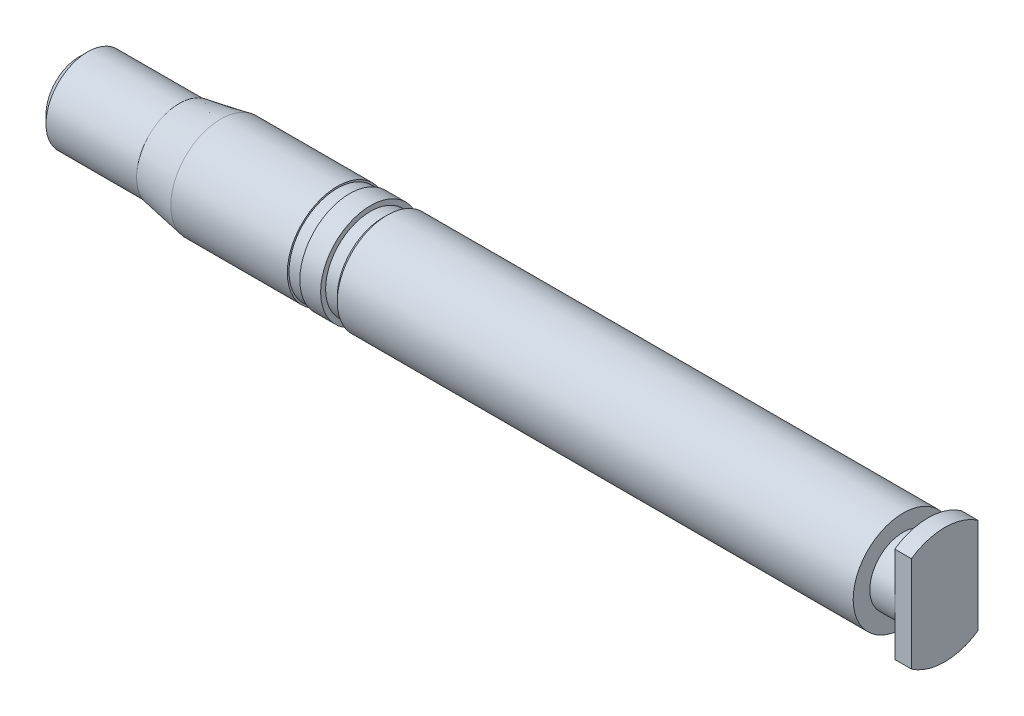
ISO-10303-21;
HEADER;
FILE_DESCRIPTION(('STEP AP214'),'2;1');
FILE_NAME('part.step','',(''),(''),'','','');
FILE_SCHEMA(('AUTOMOTIVE_DESIGN { 1 0 10303 214 1 1 1 1 }'));
ENDSEC;
DATA;
#1=APPLICATION_CONTEXT('core data for automotive mechanical design processes');
#2=APPLICATION_PROTOCOL_DEFINITION('international standard','automotive_design',2000,#1);
#3=PRODUCT_CONTEXT('',#1,'mechanical');
#4=PRODUCT('Part','Part','',(#3));
#5=PRODUCT_RELATED_PRODUCT_CATEGORY('part','',(#4));
#6=PRODUCT_DEFINITION_FORMATION('','',#4);
#7=PRODUCT_DEFINITION_CONTEXT('part definition',#1,'design');
#8=PRODUCT_DEFINITION('design','',#6,#7);
#9=PRODUCT_DEFINITION_SHAPE('','',#8);
#10=(LENGTH_UNIT() NAMED_UNIT(*) SI_UNIT(.MILLI.,.METRE.));
#11=(NAMED_UNIT(*) PLANE_ANGLE_UNIT() SI_UNIT($,.RADIAN.));
#12=(NAMED_UNIT(*) SI_UNIT($,.STERADIAN.) SOLID_ANGLE_UNIT());
#13=UNCERTAINTY_MEASURE_WITH_UNIT(LENGTH_MEASURE(1.E-05),#10,'distance_accuracy_value','');
#14=(GEOMETRIC_REPRESENTATION_CONTEXT(3) GLOBAL_UNCERTAINTY_ASSIGNED_CONTEXT((#13)) GLOBAL_UNIT_ASSIGNED_CONTEXT((#10,
#11,#12)) REPRESENTATION_CONTEXT('',''));
#15=CARTESIAN_POINT('',(0.,0.,0.));
#16=DIRECTION('',(0.,0.,1.));
#17=DIRECTION('',(1.,0.,0.));
#18=AXIS2_PLACEMENT_3D('',#15,#16,#17);
#19=CARTESIAN_POINT('',(102.,4.,0.));
#20=DIRECTION('',(1.,0.,0.));
#21=DIRECTION('',(0.,0.,-1.));
#22=AXIS2_PLACEMENT_3D('',#19,#20,#21);
#23=PLANE('',#22);
#24=CARTESIAN_POINT('',(102.,0.,0.));
#25=DIRECTION('',(-1.,0.,0.));
#26=DIRECTION('',(0.,0.,1.));
#27=AXIS2_PLACEMENT_3D('',#24,#25,#26);
#28=CIRCLE('',#27,7.);
#29=CARTESIAN_POINT('',(102.,-5.74456264653803,-4.));
#30=VERTEX_POINT('',#29);
#31=CARTESIAN_POINT('',(102.,-5.74456264653803,4.));
#32=VERTEX_POINT('',#31);
#33=EDGE_CURVE('E107',#30,#32,#28,.T.);
#34=ORIENTED_EDGE('',*,*,#33,.T.);
#35=DIRECTION('',(0.,-1.,0.));
#36=VECTOR('',#35,1.);
#37=CARTESIAN_POINT('',(102.,7.54817548175518,4.));
#38=LINE('',#37,#36);
#39=CARTESIAN_POINT('',(102.,0.,4.));
#40=VERTEX_POINT('',#39);
#41=EDGE_CURVE('E90',#40,#32,#38,.T.);
#42=ORIENTED_EDGE('',*,*,#41,.F.);
#43=CARTESIAN_POINT('',(102.,0.,0.));
#44=DIRECTION('',(-1.,0.,0.));
#45=DIRECTION('',(0.,0.,1.));
#46=AXIS2_PLACEMENT_3D('',#43,#44,#45);
#47=CIRCLE('',#46,4.);
#48=CARTESIAN_POINT('',(102.,0.,-4.));
#49=VERTEX_POINT('',#48);
#50=EDGE_CURVE('E111',#49,#40,#47,.T.);
#51=ORIENTED_EDGE('',*,*,#50,.F.);
#52=DIRECTION('',(0.,1.,0.));
#53=VECTOR('',#52,1.);
#54=CARTESIAN_POINT('',(102.,7.54817548175519,-4.));
#55=LINE('',#54,#53);
#56=EDGE_CURVE('E100',#30,#49,#55,.T.);
#57=ORIENTED_EDGE('',*,*,#56,.F.);
#58=EDGE_LOOP('',(#34,#42,#51,#57));
#59=FACE_BOUND('',#58,.T.);
#60=ADVANCED_FACE('F37',(#59),#23,.F.);
#61=CARTESIAN_POINT('',(0.,0.,0.));
#62=DIRECTION('',(-1.,0.,0.));
#63=DIRECTION('',(0.,0.,1.));
#64=AXIS2_PLACEMENT_3D('',#61,#62,#63);
#65=CYLINDRICAL_SURFACE('',#64,7.);
#66=CARTESIAN_POINT('',(104.,0.,0.));
#67=DIRECTION('',(-1.,0.,0.));
#68=DIRECTION('',(0.,0.,1.));
#69=AXIS2_PLACEMENT_3D('',#66,#67,#68);
#70=CIRCLE('',#69,7.);
#71=CARTESIAN_POINT('',(104.,-5.74456264653803,-4.));
#72=VERTEX_POINT('',#71);
#73=CARTESIAN_POINT('',(104.,-5.74456264653803,4.));
#74=VERTEX_POINT('',#73);
#75=EDGE_CURVE('E99',#72,#74,#70,.T.);
#76=ORIENTED_EDGE('',*,*,#75,.T.);
#77=DIRECTION('',(-1.,0.,0.));
#78=VECTOR('',#77,1.);
#79=CARTESIAN_POINT('',(0.,-5.74456264653803,4.));
#80=LINE('',#79,#78);
#81=EDGE_CURVE('E52',#32,#74,#80,.F.);
#82=ORIENTED_EDGE('',*,*,#81,.F.);
#83=ORIENTED_EDGE('',*,*,#33,.F.);
#84=DIRECTION('',(-1.,0.,0.));
#85=VECTOR('',#84,1.);
#86=CARTESIAN_POINT('',(0.,-5.74456264653803,-4.));
#87=LINE('',#86,#85);
#88=EDGE_CURVE('E204',#72,#30,#87,.T.);
#89=ORIENTED_EDGE('',*,*,#88,.F.);
#90=EDGE_LOOP('',(#76,#82,#83,#89));
#91=FACE_BOUND('',#90,.T.);
#92=ADVANCED_FACE('F174',(#91),#65,.T.);
#93=CARTESIAN_POINT('',(0.,0.,0.));
#94=DIRECTION('',(1.,0.,0.));
#95=DIRECTION('',(0.,0.,-1.));
#96=AXIS2_PLACEMENT_3D('',#93,#94,#95);
#97=PLANE('',#96);
#98=CARTESIAN_POINT('',(0.,0.,0.));
#99=DIRECTION('',(1.,0.,0.));
#100=DIRECTION('',(0.,0.,-1.));
#101=AXIS2_PLACEMENT_3D('',#98,#99,#100);
#102=CIRCLE('',#101,4.);
#103=CARTESIAN_POINT('',(0.,0.,-4.));
#104=VERTEX_POINT('',#103);
#105=EDGE_CURVE('E150',#104,#104,#102,.F.);
#106=ORIENTED_EDGE('',*,*,#105,.T.);
#107=EDGE_LOOP('',(#106));
#108=FACE_BOUND('',#107,.T.);
#109=ADVANCED_FACE('F181',(#108),#97,.F.);
#110=CARTESIAN_POINT('',(0.,0.,0.));
#111=DIRECTION('',(-1.,0.,0.));
#112=DIRECTION('',(0.,0.,1.));
#113=AXIS2_PLACEMENT_3D('',#110,#111,#112);
#114=CYLINDRICAL_SURFACE('',#113,5.);
#115=CARTESIAN_POINT('',(1.,0.,0.));
#116=DIRECTION('',(1.,0.,0.));
#117=DIRECTION('',(0.,0.,-1.));
#118=AXIS2_PLACEMENT_3D('',#115,#116,#117);
#119=CIRCLE('',#118,5.);
#120=CARTESIAN_POINT('',(1.,0.,-5.));
#121=VERTEX_POINT('',#120);
#122=EDGE_CURVE('E153',#121,#121,#119,.T.);
#123=ORIENTED_EDGE('',*,*,#122,.T.);
#124=EDGE_LOOP('',(#123));
#125=FACE_BOUND('',#124,.T.);
#126=CARTESIAN_POINT('',(12.,0.,0.));
#127=DIRECTION('',(-1.,0.,0.));
#128=DIRECTION('',(0.,0.,1.));
#129=AXIS2_PLACEMENT_3D('',#126,#127,#128);
#130=CIRCLE('',#129,5.);
#131=CARTESIAN_POINT('',(12.,0.,5.));
#132=VERTEX_POINT('',#131);
#133=EDGE_CURVE('E147',#132,#132,#130,.T.);
#134=ORIENTED_EDGE('',*,*,#133,.T.);
#135=EDGE_LOOP('',(#134));
#136=FACE_BOUND('',#135,.T.);
#137=ADVANCED_FACE('F258',(#125,#136),#114,.T.);
#138=CARTESIAN_POINT('',(12.,5.,0.));
#139=DIRECTION('',(1.,0.,0.));
#140=DIRECTION('',(0.,0.,-1.));
#141=AXIS2_PLACEMENT_3D('',#138,#139,#140);
#142=PLANE('',#141);
#143=ORIENTED_EDGE('',*,*,#133,.F.);
#144=EDGE_LOOP('',(#143));
#145=FACE_BOUND('',#144,.T.);
#146=CARTESIAN_POINT('',(12.,0.,0.));
#147=DIRECTION('',(-1.,0.,0.));
#148=DIRECTION('',(0.,0.,1.));
#149=AXIS2_PLACEMENT_3D('',#146,#147,#148);
#150=CIRCLE('',#149,5.1183650964577);
#151=CARTESIAN_POINT('',(12.,0.,5.1183650964577));
#152=VERTEX_POINT('',#151);
#153=EDGE_CURVE('E144',#152,#152,#150,.T.);
#154=ORIENTED_EDGE('',*,*,#153,.T.);
#155=EDGE_LOOP('',(#154));
#156=FACE_BOUND('',#155,.T.);
#157=ADVANCED_FACE('F254',(#145,#156),#142,.F.);
#158=CARTESIAN_POINT('',(17.,0.,0.));
#159=DIRECTION('',(1.,0.,0.));
#160=DIRECTION('',(0.,0.,-1.));
#161=AXIS2_PLACEMENT_3D('',#158,#159,#160);
#162=CONICAL_SURFACE('',#161,5.99999999999999,0.174532925199426);
#163=ORIENTED_EDGE('',*,*,#153,.F.);
#164=EDGE_LOOP('',(#163));
#165=FACE_BOUND('',#164,.T.);
#166=CARTESIAN_POINT('',(17.,0.,0.));
#167=DIRECTION('',(-1.,0.,0.));
#168=DIRECTION('',(0.,0.,1.));
#169=AXIS2_PLACEMENT_3D('',#166,#167,#168);
#170=CIRCLE('',#169,5.99999999999999);
#171=CARTESIAN_POINT('',(17.,0.,5.99999999999999));
#172=VERTEX_POINT('',#171);
#173=EDGE_CURVE('E141',#172,#172,#170,.T.);
#174=ORIENTED_EDGE('',*,*,#173,.T.);
#175=EDGE_LOOP('',(#174));
#176=FACE_BOUND('',#175,.T.);
#177=ADVANCED_FACE('F250',(#165,#176),#162,.T.);
#178=CARTESIAN_POINT('',(0.,0.,0.));
#179=DIRECTION('',(-1.,0.,0.));
#180=DIRECTION('',(0.,0.,1.));
#181=AXIS2_PLACEMENT_3D('',#178,#179,#180);
#182=CYLINDRICAL_SURFACE('',#181,5.99999999999999);
#183=ORIENTED_EDGE('',*,*,#173,.F.);
#184=EDGE_LOOP('',(#183));
#185=FACE_BOUND('',#184,.T.);
#186=CARTESIAN_POINT('',(31.,0.,0.));
#187=DIRECTION('',(-1.,0.,0.));
#188=DIRECTION('',(0.,0.,1.));
#189=AXIS2_PLACEMENT_3D('',#186,#187,#188);
#190=CIRCLE('',#189,5.99999999999999);
#191=CARTESIAN_POINT('',(31.,0.,5.99999999999999));
#192=VERTEX_POINT('',#191);
#193=EDGE_CURVE('E138',#192,#192,#190,.T.);
#194=ORIENTED_EDGE('',*,*,#193,.T.);
#195=EDGE_LOOP('',(#194));
#196=FACE_BOUND('',#195,.T.);
#197=ADVANCED_FACE('F246',(#185,#196),#182,.T.);
#198=CARTESIAN_POINT('',(31.,5.99999999999999,0.));
#199=DIRECTION('',(-1.,0.,0.));
#200=DIRECTION('',(0.,0.,1.));
#201=AXIS2_PLACEMENT_3D('',#198,#199,#200);
#202=PLANE('',#201);
#203=ORIENTED_EDGE('',*,*,#193,.F.);
#204=EDGE_LOOP('',(#203));
#205=FACE_BOUND('',#204,.T.);
#206=CARTESIAN_POINT('',(31.,0.,0.));
#207=DIRECTION('',(-1.,0.,0.));
#208=DIRECTION('',(0.,0.,1.));
#209=AXIS2_PLACEMENT_3D('',#206,#207,#208);
#210=CIRCLE('',#209,5.80000000000001);
#211=CARTESIAN_POINT('',(31.,0.,5.80000000000001));
#212=VERTEX_POINT('',#211);
#213=EDGE_CURVE('E135',#212,#212,#210,.T.);
#214=ORIENTED_EDGE('',*,*,#213,.T.);
#215=EDGE_LOOP('',(#214));
#216=FACE_BOUND('',#215,.T.);
#217=ADVANCED_FACE('F242',(#205,#216),#202,.F.);
#218=CARTESIAN_POINT('',(0.,0.,0.));
#219=DIRECTION('',(-1.,0.,0.));
#220=DIRECTION('',(0.,0.,1.));
#221=AXIS2_PLACEMENT_3D('',#218,#219,#220);
#222=CYLINDRICAL_SURFACE('',#221,5.80000000000001);
#223=ORIENTED_EDGE('',*,*,#213,.F.);
#224=EDGE_LOOP('',(#223));
#225=FACE_BOUND('',#224,.T.);
#226=CARTESIAN_POINT('',(32.5,0.,0.));
#227=DIRECTION('',(-1.,0.,0.));
#228=DIRECTION('',(0.,0.,1.));
#229=AXIS2_PLACEMENT_3D('',#226,#227,#228);
#230=CIRCLE('',#229,5.80000000000001);
#231=CARTESIAN_POINT('',(32.5,0.,5.80000000000001));
#232=VERTEX_POINT('',#231);
#233=EDGE_CURVE('E132',#232,#232,#230,.T.);
#234=ORIENTED_EDGE('',*,*,#233,.T.);
#235=EDGE_LOOP('',(#234));
#236=FACE_BOUND('',#235,.T.);
#237=ADVANCED_FACE('F238',(#225,#236),#222,.T.);
#238=CARTESIAN_POINT('',(32.5,5.80000000000001,0.));
#239=DIRECTION('',(1.,0.,0.));
#240=DIRECTION('',(0.,0.,-1.));
#241=AXIS2_PLACEMENT_3D('',#238,#239,#240);
#242=PLANE('',#241);
#243=ORIENTED_EDGE('',*,*,#233,.F.);
#244=EDGE_LOOP('',(#243));
#245=FACE_BOUND('',#244,.T.);
#246=CARTESIAN_POINT('',(32.5,0.,0.));
#247=DIRECTION('',(-1.,0.,0.));
#248=DIRECTION('',(0.,0.,1.));
#249=AXIS2_PLACEMENT_3D('',#246,#247,#248);
#250=CIRCLE('',#249,5.99999999999999);
#251=CARTESIAN_POINT('',(32.5,0.,5.99999999999999));
#252=VERTEX_POINT('',#251);
#253=EDGE_CURVE('E129',#252,#252,#250,.T.);
#254=ORIENTED_EDGE('',*,*,#253,.T.);
#255=EDGE_LOOP('',(#254));
#256=FACE_BOUND('',#255,.T.);
#257=ADVANCED_FACE('F234',(#245,#256),#242,.F.);
#258=CARTESIAN_POINT('',(0.,0.,0.));
#259=DIRECTION('',(-1.,0.,0.));
#260=DIRECTION('',(0.,0.,1.));
#261=AXIS2_PLACEMENT_3D('',#258,#259,#260);
#262=CYLINDRICAL_SURFACE('',#261,5.99999999999999);
#263=ORIENTED_EDGE('',*,*,#253,.F.);
#264=EDGE_LOOP('',(#263));
#265=FACE_BOUND('',#264,.T.);
#266=CARTESIAN_POINT('',(35.,0.,0.));
#267=DIRECTION('',(-1.,0.,0.));
#268=DIRECTION('',(0.,0.,1.));
#269=AXIS2_PLACEMENT_3D('',#266,#267,#268);
#270=CIRCLE('',#269,5.99999999999999);
#271=CARTESIAN_POINT('',(35.,0.,5.99999999999999));
#272=VERTEX_POINT('',#271);
#273=EDGE_CURVE('E126',#272,#272,#270,.T.);
#274=ORIENTED_EDGE('',*,*,#273,.T.);
#275=EDGE_LOOP('',(#274));
#276=FACE_BOUND('',#275,.T.);
#277=ADVANCED_FACE('F230',(#265,#276),#262,.T.);
#278=CARTESIAN_POINT('',(35.,5.99999999999999,0.));
#279=DIRECTION('',(-1.,0.,0.));
#280=DIRECTION('',(0.,0.,1.));
#281=AXIS2_PLACEMENT_3D('',#278,#279,#280);
#282=PLANE('',#281);
#283=ORIENTED_EDGE('',*,*,#273,.F.);
#284=EDGE_LOOP('',(#283));
#285=FACE_BOUND('',#284,.T.);
#286=CARTESIAN_POINT('',(35.,0.,0.));
#287=DIRECTION('',(-1.,0.,0.));
#288=DIRECTION('',(0.,0.,1.));
#289=AXIS2_PLACEMENT_3D('',#286,#287,#288);
#290=CIRCLE('',#289,5.4);
#291=CARTESIAN_POINT('',(35.,0.,5.4));
#292=VERTEX_POINT('',#291);
#293=EDGE_CURVE('E123',#292,#292,#290,.T.);
#294=ORIENTED_EDGE('',*,*,#293,.T.);
#295=EDGE_LOOP('',(#294));
#296=FACE_BOUND('',#295,.T.);
#297=ADVANCED_FACE('F226',(#285,#296),#282,.F.);
#298=CARTESIAN_POINT('',(0.,0.,0.));
#299=DIRECTION('',(-1.,0.,0.));
#300=DIRECTION('',(0.,0.,1.));
#301=AXIS2_PLACEMENT_3D('',#298,#299,#300);
#302=CYLINDRICAL_SURFACE('',#301,5.4);
#303=ORIENTED_EDGE('',*,*,#293,.F.);
#304=EDGE_LOOP('',(#303));
#305=FACE_BOUND('',#304,.T.);
#306=CARTESIAN_POINT('',(36.5,0.,0.));
#307=DIRECTION('',(-1.,0.,0.));
#308=DIRECTION('',(0.,0.,1.));
#309=AXIS2_PLACEMENT_3D('',#306,#307,#308);
#310=CIRCLE('',#309,5.4);
#311=CARTESIAN_POINT('',(36.5,0.,5.4));
#312=VERTEX_POINT('',#311);
#313=EDGE_CURVE('E120',#312,#312,#310,.T.);
#314=ORIENTED_EDGE('',*,*,#313,.T.);
#315=EDGE_LOOP('',(#314));
#316=FACE_BOUND('',#315,.T.);
#317=ADVANCED_FACE('F223',(#305,#316),#302,.T.);
#318=CARTESIAN_POINT('',(36.5,5.4,0.));
#319=DIRECTION('',(1.,0.,0.));
#320=DIRECTION('',(0.,0.,-1.));
#321=AXIS2_PLACEMENT_3D('',#318,#319,#320);
#322=PLANE('',#321);
#323=CARTESIAN_POINT('',(36.5,0.,0.));
#324=DIRECTION('',(1.,0.,0.));
#325=DIRECTION('',(0.,0.,-1.));
#326=AXIS2_PLACEMENT_3D('',#323,#324,#325);
#327=CIRCLE('',#326,5.49999999999999);
#328=CARTESIAN_POINT('',(36.5,0.,-5.49999999999999));
#329=VERTEX_POINT('',#328);
#330=EDGE_CURVE('E45',#329,#329,#327,.F.);
#331=ORIENTED_EDGE('',*,*,#330,.T.);
#332=EDGE_LOOP('',(#331));
#333=FACE_BOUND('',#332,.T.);
#334=ORIENTED_EDGE('',*,*,#313,.F.);
#335=EDGE_LOOP('',(#334));
#336=FACE_BOUND('',#335,.T.);
#337=ADVANCED_FACE('F158',(#333,#336),#322,.F.);
#338=CARTESIAN_POINT('',(0.,0.,0.));
#339=DIRECTION('',(-1.,0.,0.));
#340=DIRECTION('',(0.,0.,1.));
#341=AXIS2_PLACEMENT_3D('',#338,#339,#340);
#342=CYLINDRICAL_SURFACE('',#341,5.99999999999999);
#343=CARTESIAN_POINT('',(37.,0.,0.));
#344=DIRECTION('',(1.,0.,0.));
#345=DIRECTION('',(0.,0.,-1.));
#346=AXIS2_PLACEMENT_3D('',#343,#344,#345);
#347=CIRCLE('',#346,5.99999999999999);
#348=CARTESIAN_POINT('',(37.,0.,-5.99999999999999));
#349=VERTEX_POINT('',#348);
#350=EDGE_CURVE('E11',#349,#349,#347,.T.);
#351=ORIENTED_EDGE('',*,*,#350,.T.);
#352=EDGE_LOOP('',(#351));
#353=FACE_BOUND('',#352,.T.);
#354=CARTESIAN_POINT('',(99.,0.,0.));
#355=DIRECTION('',(-1.,0.,0.));
#356=DIRECTION('',(0.,0.,1.));
#357=AXIS2_PLACEMENT_3D('',#354,#355,#356);
#358=CIRCLE('',#357,5.99999999999999);
#359=CARTESIAN_POINT('',(99.,0.,5.99999999999999));
#360=VERTEX_POINT('',#359);
#361=EDGE_CURVE('E117',#360,#360,#358,.T.);
#362=ORIENTED_EDGE('',*,*,#361,.T.);
#363=EDGE_LOOP('',(#362));
#364=FACE_BOUND('',#363,.T.);
#365=ADVANCED_FACE('F213',(#353,#364),#342,.T.);
#366=CARTESIAN_POINT('',(99.,5.99999999999999,0.));
#367=DIRECTION('',(-1.,0.,0.));
#368=DIRECTION('',(0.,0.,1.));
#369=AXIS2_PLACEMENT_3D('',#366,#367,#368);
#370=PLANE('',#369);
#371=ORIENTED_EDGE('',*,*,#361,.F.);
#372=EDGE_LOOP('',(#371));
#373=FACE_BOUND('',#372,.T.);
#374=CARTESIAN_POINT('',(99.,0.,0.));
#375=DIRECTION('',(-1.,0.,0.));
#376=DIRECTION('',(0.,0.,1.));
#377=AXIS2_PLACEMENT_3D('',#374,#375,#376);
#378=CIRCLE('',#377,4.);
#379=CARTESIAN_POINT('',(99.,0.,4.));
#380=VERTEX_POINT('',#379);
#381=EDGE_CURVE('E114',#380,#380,#378,.T.);
#382=ORIENTED_EDGE('',*,*,#381,.T.);
#383=EDGE_LOOP('',(#382));
#384=FACE_BOUND('',#383,.T.);
#385=ADVANCED_FACE('F192',(#373,#384),#370,.F.);
#386=CARTESIAN_POINT('',(0.,0.,0.));
#387=DIRECTION('',(-1.,0.,0.));
#388=DIRECTION('',(0.,0.,1.));
#389=AXIS2_PLACEMENT_3D('',#386,#387,#388);
#390=CYLINDRICAL_SURFACE('',#389,4.);
#391=ORIENTED_EDGE('',*,*,#381,.F.);
#392=EDGE_LOOP('',(#391));
#393=FACE_BOUND('',#392,.T.);
#394=ORIENTED_EDGE('',*,*,#50,.T.);
#395=EDGE_CURVE('E110',#40,#49,#47,.T.);
#396=ORIENTED_EDGE('',*,*,#395,.T.);
#397=EDGE_LOOP('',(#394,#396));
#398=FACE_BOUND('',#397,.T.);
#399=ADVANCED_FACE('F186',(#393,#398),#390,.T.);
#400=ORIENTED_EDGE('',*,*,#395,.F.);
#401=CARTESIAN_POINT('',(102.,5.74456264653803,4.));
#402=VERTEX_POINT('',#401);
#403=EDGE_CURVE('E196',#402,#40,#38,.T.);
#404=ORIENTED_EDGE('',*,*,#403,.F.);
#405=CARTESIAN_POINT('',(102.,5.74456264653803,-4.));
#406=VERTEX_POINT('',#405);
#407=EDGE_CURVE('E94',#402,#406,#28,.T.);
#408=ORIENTED_EDGE('',*,*,#407,.T.);
#409=EDGE_CURVE('E103',#49,#406,#55,.T.);
#410=ORIENTED_EDGE('',*,*,#409,.F.);
#411=EDGE_LOOP('',(#400,#404,#408,#410));
#412=FACE_BOUND('',#411,.T.);
#413=ADVANCED_FACE('F177',(#412),#23,.F.);
#414=ORIENTED_EDGE('',*,*,#407,.F.);
#415=DIRECTION('',(-1.,0.,0.));
#416=VECTOR('',#415,1.);
#417=CARTESIAN_POINT('',(0.,5.74456264653803,4.));
#418=LINE('',#417,#416);
#419=CARTESIAN_POINT('',(104.,5.74456264653803,4.));
#420=VERTEX_POINT('',#419);
#421=EDGE_CURVE('E85',#420,#402,#418,.T.);
#422=ORIENTED_EDGE('',*,*,#421,.F.);
#423=CARTESIAN_POINT('',(104.,5.74456264653803,-4.));
#424=VERTEX_POINT('',#423);
#425=EDGE_CURVE('E60',#420,#424,#70,.T.);
#426=ORIENTED_EDGE('',*,*,#425,.T.);
#427=DIRECTION('',(-1.,0.,0.));
#428=VECTOR('',#427,1.);
#429=CARTESIAN_POINT('',(0.,5.74456264653803,-4.));
#430=LINE('',#429,#428);
#431=EDGE_CURVE('E208',#406,#424,#430,.F.);
#432=ORIENTED_EDGE('',*,*,#431,.F.);
#433=EDGE_LOOP('',(#414,#422,#426,#432));
#434=FACE_BOUND('',#433,.T.);
#435=ADVANCED_FACE('F93',(#434),#65,.T.);
#436=CARTESIAN_POINT('',(104.,7.,0.));
#437=DIRECTION('',(-1.,0.,0.));
#438=DIRECTION('',(0.,0.,1.));
#439=AXIS2_PLACEMENT_3D('',#436,#437,#438);
#440=PLANE('',#439);
#441=ORIENTED_EDGE('',*,*,#425,.F.);
#442=DIRECTION('',(0.,1.,0.));
#443=VECTOR('',#442,1.);
#444=CARTESIAN_POINT('',(104.,7.54817548175518,4.));
#445=LINE('',#444,#443);
#446=EDGE_CURVE('E83',#74,#420,#445,.T.);
#447=ORIENTED_EDGE('',*,*,#446,.F.);
#448=ORIENTED_EDGE('',*,*,#75,.F.);
#449=DIRECTION('',(0.,-1.,0.));
#450=VECTOR('',#449,1.);
#451=CARTESIAN_POINT('',(104.,7.54817548175519,-4.));
#452=LINE('',#451,#450);
#453=EDGE_CURVE('E98',#424,#72,#452,.T.);
#454=ORIENTED_EDGE('',*,*,#453,.F.);
#455=EDGE_LOOP('',(#441,#447,#448,#454));
#456=FACE_BOUND('',#455,.T.);
#457=ADVANCED_FACE('F97',(#456),#440,.F.);
#458=CARTESIAN_POINT('',(0.,0.,0.));
#459=DIRECTION('',(1.,0.,0.));
#460=DIRECTION('',(0.,0.,-1.));
#461=AXIS2_PLACEMENT_3D('',#458,#459,#460);
#462=CONICAL_SURFACE('',#461,4.,0.785398163397447);
#463=ORIENTED_EDGE('',*,*,#122,.F.);
#464=EDGE_LOOP('',(#463));
#465=FACE_BOUND('',#464,.T.);
#466=ORIENTED_EDGE('',*,*,#105,.F.);
#467=EDGE_LOOP('',(#466));
#468=FACE_BOUND('',#467,.T.);
#469=ADVANCED_FACE('F163',(#465,#468),#462,.T.);
#470=CARTESIAN_POINT('',(36.5,0.,0.));
#471=DIRECTION('',(1.,0.,0.));
#472=DIRECTION('',(0.,0.,-1.));
#473=AXIS2_PLACEMENT_3D('',#470,#471,#472);
#474=CONICAL_SURFACE('',#473,5.49999999999999,0.785398163397448);
#475=ORIENTED_EDGE('',*,*,#350,.F.);
#476=EDGE_LOOP('',(#475));
#477=FACE_BOUND('',#476,.T.);
#478=ORIENTED_EDGE('',*,*,#330,.F.);
#479=EDGE_LOOP('',(#478));
#480=FACE_BOUND('',#479,.T.);
#481=ADVANCED_FACE('F39',(#477,#480),#474,.T.);
#482=CARTESIAN_POINT('',(-0.001000000000001,7.54817548175519,-4.));
#483=DIRECTION('',(0.,0.,1.));
#484=DIRECTION('',(0.,-1.,0.));
#485=AXIS2_PLACEMENT_3D('',#482,#483,#484);
#486=PLANE('',#485);
#487=ORIENTED_EDGE('',*,*,#431,.T.);
#488=ORIENTED_EDGE('',*,*,#453,.T.);
#489=ORIENTED_EDGE('',*,*,#88,.T.);
#490=ORIENTED_EDGE('',*,*,#56,.T.);
#491=ORIENTED_EDGE('',*,*,#409,.T.);
#492=EDGE_LOOP('',(#487,#488,#489,#490,#491));
#493=FACE_BOUND('',#492,.T.);
#494=ADVANCED_FACE('F162',(#493),#486,.F.);
#495=CARTESIAN_POINT('',(-0.001000000000001,7.54817548175518,4.));
#496=DIRECTION('',(0.,0.,-1.));
#497=DIRECTION('',(0.,1.,0.));
#498=AXIS2_PLACEMENT_3D('',#495,#496,#497);
#499=PLANE('',#498);
#500=ORIENTED_EDGE('',*,*,#81,.T.);
#501=ORIENTED_EDGE('',*,*,#446,.T.);
#502=ORIENTED_EDGE('',*,*,#421,.T.);
#503=ORIENTED_EDGE('',*,*,#403,.T.);
#504=ORIENTED_EDGE('',*,*,#41,.T.);
#505=EDGE_LOOP('',(#500,#501,#502,#503,#504));
#506=FACE_BOUND('',#505,.T.);
#507=ADVANCED_FACE('F84',(#506),#499,.F.);
#508=CLOSED_SHELL('',(#60,#92,#109,#137,#157,#177,#197,#217,#237,#257,#277,#297,#317,#337,#365,
#385,#399,#413,#435,#457,#469,#481,#494,#507));
#509=MANIFOLD_SOLID_BREP('B2',#508);
#510=ADVANCED_BREP_SHAPE_REPRESENTATION('',(#18,#509),#14);
#511=SHAPE_DEFINITION_REPRESENTATION(#9,#510);
ENDSEC;
END-ISO-10303-21;
